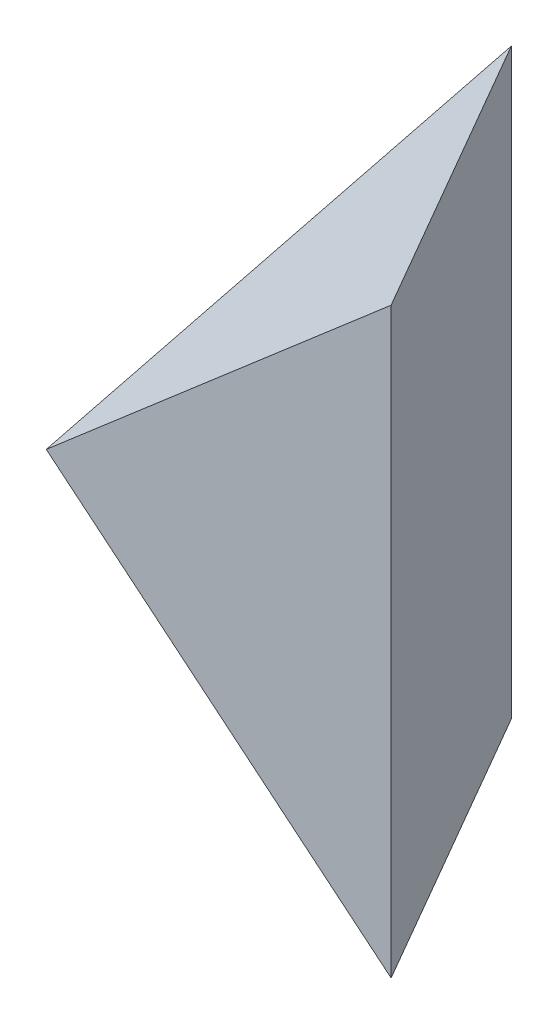
ISO-10303-21;
HEADER;
FILE_DESCRIPTION(('STEP AP214'),'2;1');
FILE_NAME('part.step','',(''),(''),'','','');
FILE_SCHEMA(('AUTOMOTIVE_DESIGN { 1 0 10303 214 1 1 1 1 }'));
ENDSEC;
DATA;
#1=APPLICATION_CONTEXT('core data for automotive mechanical design processes');
#2=APPLICATION_PROTOCOL_DEFINITION('international standard','automotive_design',2000,#1);
#3=PRODUCT_CONTEXT('',#1,'mechanical');
#4=PRODUCT('Part','Part','',(#3));
#5=PRODUCT_RELATED_PRODUCT_CATEGORY('part','',(#4));
#6=PRODUCT_DEFINITION_FORMATION('','',#4);
#7=PRODUCT_DEFINITION_CONTEXT('part definition',#1,'design');
#8=PRODUCT_DEFINITION('design','',#6,#7);
#9=PRODUCT_DEFINITION_SHAPE('','',#8);
#10=(LENGTH_UNIT() NAMED_UNIT(*) SI_UNIT(.MILLI.,.METRE.));
#11=(NAMED_UNIT(*) PLANE_ANGLE_UNIT() SI_UNIT($,.RADIAN.));
#12=(NAMED_UNIT(*) SI_UNIT($,.STERADIAN.) SOLID_ANGLE_UNIT());
#13=UNCERTAINTY_MEASURE_WITH_UNIT(LENGTH_MEASURE(1.E-05),#10,'distance_accuracy_value','');
#14=(GEOMETRIC_REPRESENTATION_CONTEXT(3) GLOBAL_UNCERTAINTY_ASSIGNED_CONTEXT((#13)) GLOBAL_UNIT_ASSIGNED_CONTEXT((#10,
#11,#12)) REPRESENTATION_CONTEXT('',''));
#15=CARTESIAN_POINT('',(0.,0.,0.));
#16=DIRECTION('',(0.,0.,1.));
#17=DIRECTION('',(1.,0.,0.));
#18=AXIS2_PLACEMENT_3D('',#15,#16,#17);
#19=CARTESIAN_POINT('',(769.58996475541,508.84863155784,178.87286005287));
#20=DIRECTION('',(-0.866025403784329,0.,0.50000000000019));
#21=DIRECTION('',(0.,1.,0.));
#22=AXIS2_PLACEMENT_3D('',#19,#20,#21);
#23=PLANE('',#22);
#24=DIRECTION('',(0.,-1.,0.));
#25=VECTOR('',#24,1.);
#26=CARTESIAN_POINT('',(769.58996475541,508.84863155784,178.87286005287));
#27=LINE('',#26,#25);
#28=CARTESIAN_POINT('',(769.58996475541,508.84863155784,178.87286005287));
#29=VERTEX_POINT('',#28);
#30=CARTESIAN_POINT('',(769.58996475541,-473.8486315578,178.87286005287));
#31=VERTEX_POINT('',#30);
#32=EDGE_CURVE('E104',#29,#31,#27,.T.);
#33=ORIENTED_EDGE('',*,*,#32,.T.);
#34=DIRECTION('',(-0.50000000000019,0.,-0.866025403784329));
#35=VECTOR('',#34,1.);
#36=CARTESIAN_POINT('',(769.58996475541,-473.8486315578,178.87286005287));
#37=LINE('',#36,#35);
#38=CARTESIAN_POINT('',(492.43543902902,-473.8486315578,-301.1728600528));
#39=VERTEX_POINT('',#38);
#40=EDGE_CURVE('E69',#31,#39,#37,.T.);
#41=ORIENTED_EDGE('',*,*,#40,.T.);
#42=DIRECTION('',(0.,1.,0.));
#43=VECTOR('',#42,1.);
#44=CARTESIAN_POINT('',(492.43543902902,-473.8486315578,-301.1728600528));
#45=LINE('',#44,#43);
#46=CARTESIAN_POINT('',(492.43543902902,508.84863155784,-301.1728600528));
#47=VERTEX_POINT('',#46);
#48=EDGE_CURVE('E92',#39,#47,#45,.T.);
#49=ORIENTED_EDGE('',*,*,#48,.T.);
#50=DIRECTION('',(0.50000000000019,0.,0.866025403784329));
#51=VECTOR('',#50,1.);
#52=CARTESIAN_POINT('',(492.43543902902,508.84863155784,-301.1728600528));
#53=LINE('',#52,#51);
#54=EDGE_CURVE('E10',#47,#29,#53,.T.);
#55=ORIENTED_EDGE('',*,*,#54,.T.);
#56=EDGE_LOOP('',(#33,#41,#49,#55));
#57=FACE_BOUND('',#56,.T.);
#58=ADVANCED_FACE('F15',(#57),#23,.F.);
#59=CARTESIAN_POINT('',(198.57158996475,17.991348631558,188.84002286005));
#60=DIRECTION('',(-0.866025403784329,0.,0.50000000000019));
#61=DIRECTION('',(0.,1.,0.));
#62=AXIS2_PLACEMENT_3D('',#59,#60,#61);
#63=PLANE('',#62);
#64=DIRECTION('',(0.50000000000019,0.,0.866025403784329));
#65=VECTOR('',#64,1.);
#66=CARTESIAN_POINT('',(198.29443543902,17.991348631558,188.35997713994));
#67=LINE('',#66,#65);
#68=CARTESIAN_POINT('',(198.29443543902,17.991348631558,188.35997713994));
#69=VERTEX_POINT('',#68);
#70=CARTESIAN_POINT('',(198.57158996475,17.991348631558,188.84002286005));
#71=VERTEX_POINT('',#70);
#72=EDGE_CURVE('E30',#69,#71,#67,.T.);
#73=ORIENTED_EDGE('',*,*,#72,.F.);
#74=DIRECTION('',(0.,1.,0.));
#75=VECTOR('',#74,1.);
#76=CARTESIAN_POINT('',(198.29443543902,17.008651368442,188.35997713994));
#77=LINE('',#76,#75);
#78=CARTESIAN_POINT('',(198.29443543902,17.008651368442,188.35997713994));
#79=VERTEX_POINT('',#78);
#80=EDGE_CURVE('E79',#79,#69,#77,.T.);
#81=ORIENTED_EDGE('',*,*,#80,.F.);
#82=DIRECTION('',(-0.50000000000019,0.,-0.866025403784329));
#83=VECTOR('',#82,1.);
#84=CARTESIAN_POINT('',(198.57158996475,17.008651368442,188.84002286005));
#85=LINE('',#84,#83);
#86=CARTESIAN_POINT('',(198.57158996475,17.008651368442,188.84002286005));
#87=VERTEX_POINT('',#86);
#88=EDGE_CURVE('E84',#87,#79,#85,.T.);
#89=ORIENTED_EDGE('',*,*,#88,.F.);
#90=DIRECTION('',(0.,-1.,0.));
#91=VECTOR('',#90,1.);
#92=CARTESIAN_POINT('',(198.57158996475,17.991348631558,188.84002286005));
#93=LINE('',#92,#91);
#94=EDGE_CURVE('E108',#71,#87,#93,.T.);
#95=ORIENTED_EDGE('',*,*,#94,.F.);
#96=EDGE_LOOP('',(#73,#81,#89,#95));
#97=FACE_BOUND('',#96,.T.);
#98=ADVANCED_FACE('F81',(#97),#63,.T.);
#99=CARTESIAN_POINT('',(198.29443543902,17.991348631558,188.35997713994));
#100=CARTESIAN_POINT('',(492.43543902902,508.84863155784,-301.1728600528));
#101=CARTESIAN_POINT('',(198.57158996475,17.991348631558,188.84002286005));
#102=CARTESIAN_POINT('',(769.58996475541,508.84863155784,178.87286005287));
#103=(BOUNDED_SURFACE() B_SPLINE_SURFACE(1,1,((#99,#100),(#101,#102)),.UNSPECIFIED.,.F.,.F.,
.F.) B_SPLINE_SURFACE_WITH_KNOTS((2,2),(2,2),(0.,554.30905145276),(0.,1.),
.UNSPECIFIED.) GEOMETRIC_REPRESENTATION_ITEM() RATIONAL_B_SPLINE_SURFACE(((1.,1.),(1.,1.))) REPRESENTATION_ITEM('') SURFACE());
#104=CARTESIAN_POINT('',(198.57158996475,17.991348631558,188.84002286005));
#105=CARTESIAN_POINT('',(769.58996475541,508.84863155784,178.87286005287));
#106=(BOUNDED_CURVE() B_SPLINE_CURVE(1,(#104,#105),.UNSPECIFIED.,.F.,
.F.) B_SPLINE_CURVE_WITH_KNOTS((2,2),(0.,1.),
.UNSPECIFIED.) CURVE() GEOMETRIC_REPRESENTATION_ITEM() RATIONAL_B_SPLINE_CURVE((1.,1.)) REPRESENTATION_ITEM(''));
#107=EDGE_CURVE('E21',#71,#29,#106,.T.);
#108=CARTESIAN_POINT('',(198.29443543902,17.991348631558,188.35997713994));
#109=CARTESIAN_POINT('',(492.43543902902,508.84863155784,-301.1728600528));
#110=(BOUNDED_CURVE() B_SPLINE_CURVE(1,(#108,#109),.UNSPECIFIED.,.F.,
.F.) B_SPLINE_CURVE_WITH_KNOTS((2,2),(0.,1.),
.UNSPECIFIED.) CURVE() GEOMETRIC_REPRESENTATION_ITEM() RATIONAL_B_SPLINE_CURVE((1.,1.)) REPRESENTATION_ITEM(''));
#111=EDGE_CURVE('E88',#69,#47,#110,.T.);
#112=ORIENTED_EDGE('',*,*,#72,.T.);
#113=ORIENTED_EDGE('',*,*,#107,.T.);
#114=ORIENTED_EDGE('',*,*,#54,.F.);
#115=ORIENTED_EDGE('',*,*,#111,.F.);
#116=EDGE_LOOP('',(#112,#113,#114,#115));
#117=FACE_BOUND('',#116,.T.);
#118=ADVANCED_FACE('F17',(#117),#103,.T.);
#119=CARTESIAN_POINT('',(198.29443543902,17.008651368442,188.35997713994));
#120=CARTESIAN_POINT('',(492.43543902902,-473.8486315578,-301.1728600528));
#121=CARTESIAN_POINT('',(198.29443543902,17.991348631558,188.35997713994));
#122=CARTESIAN_POINT('',(492.43543902902,508.84863155784,-301.1728600528));
#123=(BOUNDED_SURFACE() B_SPLINE_SURFACE(1,1,((#119,#120),(#121,#122)),.UNSPECIFIED.,.F.,.F.,
.F.) B_SPLINE_SURFACE_WITH_KNOTS((2,2),(2,2),(0.,982.69726311569),(0.,1.),
.UNSPECIFIED.) GEOMETRIC_REPRESENTATION_ITEM() RATIONAL_B_SPLINE_SURFACE(((1.,1.),(1.,1.))) REPRESENTATION_ITEM('') SURFACE());
#124=CARTESIAN_POINT('',(198.29443543902,17.008651368442,188.35997713994));
#125=CARTESIAN_POINT('',(492.43543902902,-473.8486315578,-301.1728600528));
#126=(BOUNDED_CURVE() B_SPLINE_CURVE(1,(#124,#125),.UNSPECIFIED.,.F.,
.F.) B_SPLINE_CURVE_WITH_KNOTS((2,2),(0.,1.),
.UNSPECIFIED.) CURVE() GEOMETRIC_REPRESENTATION_ITEM() RATIONAL_B_SPLINE_CURVE((1.,1.)) REPRESENTATION_ITEM(''));
#127=EDGE_CURVE('E90',#79,#39,#126,.T.);
#128=ORIENTED_EDGE('',*,*,#80,.T.);
#129=ORIENTED_EDGE('',*,*,#111,.T.);
#130=ORIENTED_EDGE('',*,*,#48,.F.);
#131=ORIENTED_EDGE('',*,*,#127,.F.);
#132=EDGE_LOOP('',(#128,#129,#130,#131));
#133=FACE_BOUND('',#132,.T.);
#134=ADVANCED_FACE('F91',(#133),#123,.T.);
#135=CARTESIAN_POINT('',(198.57158996475,17.008651368442,188.84002286005));
#136=CARTESIAN_POINT('',(769.58996475541,-473.8486315578,178.87286005287));
#137=CARTESIAN_POINT('',(198.29443543902,17.008651368442,188.35997713994));
#138=CARTESIAN_POINT('',(492.43543902902,-473.8486315578,-301.1728600528));
#139=(BOUNDED_SURFACE() B_SPLINE_SURFACE(1,1,((#135,#136),(#137,#138)),.UNSPECIFIED.,.F.,.F.,
.F.) B_SPLINE_SURFACE_WITH_KNOTS((2,2),(2,2),(0.,554.30905145276),(0.,1.),
.UNSPECIFIED.) GEOMETRIC_REPRESENTATION_ITEM() RATIONAL_B_SPLINE_SURFACE(((1.,1.),(1.,1.))) REPRESENTATION_ITEM('') SURFACE());
#140=CARTESIAN_POINT('',(198.57158996475,17.008651368442,188.84002286005));
#141=CARTESIAN_POINT('',(769.58996475541,-473.8486315578,178.87286005287));
#142=(BOUNDED_CURVE() B_SPLINE_CURVE(1,(#140,#141),.UNSPECIFIED.,.F.,
.F.) B_SPLINE_CURVE_WITH_KNOTS((2,2),(0.,1.),
.UNSPECIFIED.) CURVE() GEOMETRIC_REPRESENTATION_ITEM() RATIONAL_B_SPLINE_CURVE((1.,1.)) REPRESENTATION_ITEM(''));
#143=EDGE_CURVE('E97',#87,#31,#142,.T.);
#144=ORIENTED_EDGE('',*,*,#88,.T.);
#145=ORIENTED_EDGE('',*,*,#127,.T.);
#146=ORIENTED_EDGE('',*,*,#40,.F.);
#147=ORIENTED_EDGE('',*,*,#143,.F.);
#148=EDGE_LOOP('',(#144,#145,#146,#147));
#149=FACE_BOUND('',#148,.T.);
#150=ADVANCED_FACE('F95',(#149),#139,.T.);
#151=CARTESIAN_POINT('',(198.57158996475,17.991348631558,188.84002286005));
#152=CARTESIAN_POINT('',(769.58996475541,508.84863155784,178.87286005287));
#153=CARTESIAN_POINT('',(198.57158996475,17.008651368442,188.84002286005));
#154=CARTESIAN_POINT('',(769.58996475541,-473.8486315578,178.87286005287));
#155=(BOUNDED_SURFACE() B_SPLINE_SURFACE(1,1,((#151,#152),(#153,#154)),.UNSPECIFIED.,.F.,.F.,
.F.) B_SPLINE_SURFACE_WITH_KNOTS((2,2),(2,2),(0.,982.69726311569),(0.,1.),
.UNSPECIFIED.) GEOMETRIC_REPRESENTATION_ITEM() RATIONAL_B_SPLINE_SURFACE(((1.,1.),(1.,1.))) REPRESENTATION_ITEM('') SURFACE());
#156=ORIENTED_EDGE('',*,*,#94,.T.);
#157=ORIENTED_EDGE('',*,*,#143,.T.);
#158=ORIENTED_EDGE('',*,*,#32,.F.);
#159=ORIENTED_EDGE('',*,*,#107,.F.);
#160=EDGE_LOOP('',(#156,#157,#158,#159));
#161=FACE_BOUND('',#160,.T.);
#162=ADVANCED_FACE('F135',(#161),#155,.T.);
#163=CLOSED_SHELL('',(#58,#98,#118,#134,#150,#162));
#164=MANIFOLD_SOLID_BREP('B1',#163);
#165=ADVANCED_BREP_SHAPE_REPRESENTATION('',(#18,#164),#14);
#166=SHAPE_DEFINITION_REPRESENTATION(#9,#165);
ENDSEC;
END-ISO-10303-21;
